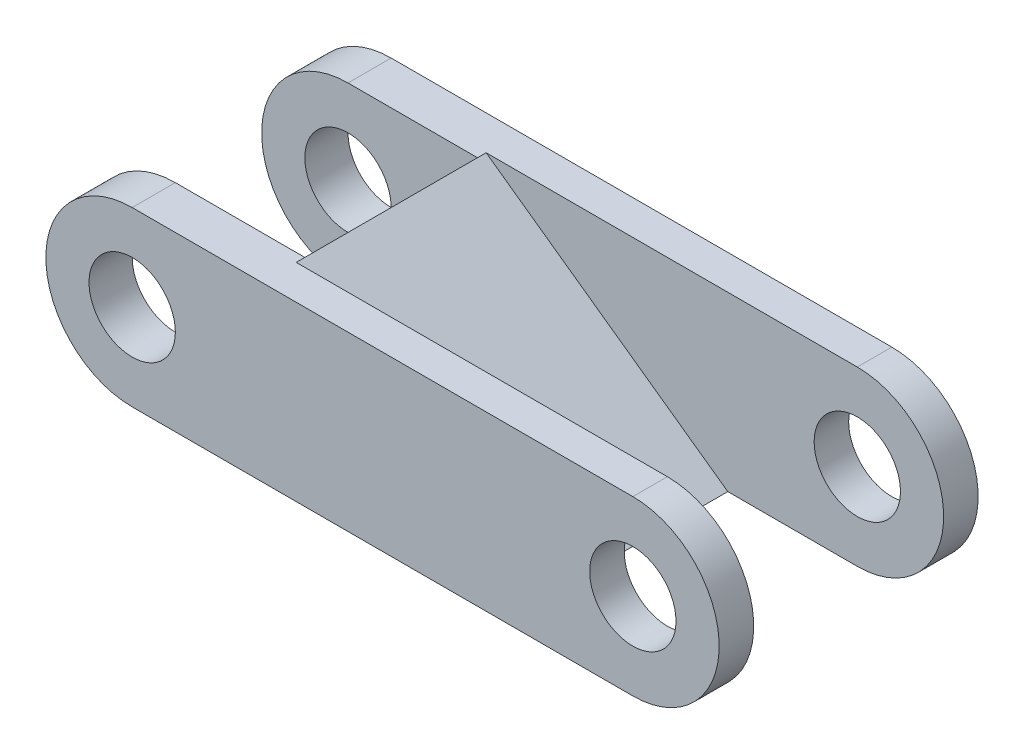
ISO-10303-21;
HEADER;
FILE_DESCRIPTION(('STEP AP214'),'2;1');
FILE_NAME('part.step','',(''),(''),'','','');
FILE_SCHEMA(('AUTOMOTIVE_DESIGN { 1 0 10303 214 1 1 1 1 }'));
ENDSEC;
DATA;
#1=APPLICATION_CONTEXT('core data for automotive mechanical design processes');
#2=APPLICATION_PROTOCOL_DEFINITION('international standard','automotive_design',2000,#1);
#3=PRODUCT_CONTEXT('',#1,'mechanical');
#4=PRODUCT('Part','Part','',(#3));
#5=PRODUCT_RELATED_PRODUCT_CATEGORY('part','',(#4));
#6=PRODUCT_DEFINITION_FORMATION('','',#4);
#7=PRODUCT_DEFINITION_CONTEXT('part definition',#1,'design');
#8=PRODUCT_DEFINITION('design','',#6,#7);
#9=PRODUCT_DEFINITION_SHAPE('','',#8);
#10=(LENGTH_UNIT() NAMED_UNIT(*) SI_UNIT(.MILLI.,.METRE.));
#11=(NAMED_UNIT(*) PLANE_ANGLE_UNIT() SI_UNIT($,.RADIAN.));
#12=(NAMED_UNIT(*) SI_UNIT($,.STERADIAN.) SOLID_ANGLE_UNIT());
#13=UNCERTAINTY_MEASURE_WITH_UNIT(LENGTH_MEASURE(1.E-05),#10,'distance_accuracy_value','');
#14=(GEOMETRIC_REPRESENTATION_CONTEXT(3) GLOBAL_UNCERTAINTY_ASSIGNED_CONTEXT((#13)) GLOBAL_UNIT_ASSIGNED_CONTEXT((#10,
#11,#12)) REPRESENTATION_CONTEXT('',''));
#15=CARTESIAN_POINT('',(0.,0.,0.));
#16=DIRECTION('',(0.,0.,1.));
#17=DIRECTION('',(1.,0.,0.));
#18=AXIS2_PLACEMENT_3D('',#15,#16,#17);
#19=CARTESIAN_POINT('',(0.,10.,30.));
#20=DIRECTION('',(0.,-1.,0.));
#21=DIRECTION('',(0.,0.,-1.));
#22=AXIS2_PLACEMENT_3D('',#19,#20,#21);
#23=PLANE('',#22);
#24=DIRECTION('',(0.,0.,1.));
#25=VECTOR('',#24,1.);
#26=CARTESIAN_POINT('',(15.,10.,-30.404313133584));
#27=LINE('',#26,#25);
#28=CARTESIAN_POINT('',(15.,10.,4.));
#29=VERTEX_POINT('',#28);
#30=CARTESIAN_POINT('',(15.,10.,5.));
#31=VERTEX_POINT('',#30);
#32=EDGE_CURVE('E55',#29,#31,#27,.T.);
#33=ORIENTED_EDGE('',*,*,#32,.F.);
#34=DIRECTION('',(-1.,0.,0.));
#35=VECTOR('',#34,1.);
#36=CARTESIAN_POINT('',(42.9938700824609,10.,4.));
#37=LINE('',#36,#35);
#38=CARTESIAN_POINT('',(57.9938700824609,10.,4.));
#39=VERTEX_POINT('',#38);
#40=EDGE_CURVE('E149',#39,#29,#37,.T.);
#41=ORIENTED_EDGE('',*,*,#40,.F.);
#42=DIRECTION('',(0.,0.,-1.));
#43=VECTOR('',#42,1.);
#44=CARTESIAN_POINT('',(57.9938700824609,10.,30.));
#45=LINE('',#44,#43);
#46=CARTESIAN_POINT('',(57.9938700824609,10.,0.));
#47=VERTEX_POINT('',#46);
#48=EDGE_CURVE('E211',#39,#47,#45,.T.);
#49=ORIENTED_EDGE('',*,*,#48,.T.);
#50=DIRECTION('',(-1.,0.,0.));
#51=VECTOR('',#50,1.);
#52=CARTESIAN_POINT('',(0.,10.,0.));
#53=LINE('',#52,#51);
#54=CARTESIAN_POINT('',(0.,10.,0.));
#55=VERTEX_POINT('',#54);
#56=EDGE_CURVE('E195',#47,#55,#53,.T.);
#57=ORIENTED_EDGE('',*,*,#56,.T.);
#58=DIRECTION('',(0.,0.,-1.));
#59=VECTOR('',#58,1.);
#60=CARTESIAN_POINT('',(0.,10.,30.));
#61=LINE('',#60,#59);
#62=CARTESIAN_POINT('',(0.,10.,5.));
#63=VERTEX_POINT('',#62);
#64=EDGE_CURVE('E86',#63,#55,#61,.T.);
#65=ORIENTED_EDGE('',*,*,#64,.F.);
#66=DIRECTION('',(-1.,0.,0.));
#67=VECTOR('',#66,1.);
#68=CARTESIAN_POINT('',(15.,10.,5.));
#69=LINE('',#68,#67);
#70=EDGE_CURVE('E300',#31,#63,#69,.T.);
#71=ORIENTED_EDGE('',*,*,#70,.F.);
#72=EDGE_LOOP('',(#33,#41,#49,#57,#65,#71));
#73=FACE_BOUND('',#72,.T.);
#74=ADVANCED_FACE('F38',(#73),#23,.F.);
#75=CARTESIAN_POINT('',(0.,0.,30.));
#76=DIRECTION('',(0.,0.,-1.));
#77=DIRECTION('',(-1.,0.,0.));
#78=AXIS2_PLACEMENT_3D('',#75,#76,#77);
#79=CYLINDRICAL_SURFACE('',#78,10.);
#80=CARTESIAN_POINT('',(0.,10.,30.));
#81=VERTEX_POINT('',#80);
#82=CARTESIAN_POINT('',(0.,10.,25.));
#83=VERTEX_POINT('',#82);
#84=EDGE_CURVE('E208',#81,#83,#61,.T.);
#85=ORIENTED_EDGE('',*,*,#84,.T.);
#86=CARTESIAN_POINT('',(0.,0.,25.));
#87=DIRECTION('',(0.,0.,1.));
#88=DIRECTION('',(1.,0.,0.));
#89=AXIS2_PLACEMENT_3D('',#86,#87,#88);
#90=CIRCLE('',#89,10.);
#91=CARTESIAN_POINT('',(0.,-10.,25.));
#92=VERTEX_POINT('',#91);
#93=EDGE_CURVE('E178',#83,#92,#90,.T.);
#94=ORIENTED_EDGE('',*,*,#93,.T.);
#95=DIRECTION('',(0.,0.,-1.));
#96=VECTOR('',#95,1.);
#97=CARTESIAN_POINT('',(0.,-10.,30.));
#98=LINE('',#97,#96);
#99=CARTESIAN_POINT('',(0.,-10.,30.));
#100=VERTEX_POINT('',#99);
#101=EDGE_CURVE('E11',#100,#92,#98,.T.);
#102=ORIENTED_EDGE('',*,*,#101,.F.);
#103=CARTESIAN_POINT('',(0.,0.,30.));
#104=DIRECTION('',(0.,0.,1.));
#105=DIRECTION('',(1.,0.,0.));
#106=AXIS2_PLACEMENT_3D('',#103,#104,#105);
#107=CIRCLE('',#106,10.);
#108=EDGE_CURVE('E193',#81,#100,#107,.T.);
#109=ORIENTED_EDGE('',*,*,#108,.F.);
#110=EDGE_LOOP('',(#85,#94,#102,#109));
#111=FACE_BOUND('',#110,.T.);
#112=ADVANCED_FACE('F263',(#111),#79,.T.);
#113=CARTESIAN_POINT('',(57.9938700824609,0.,30.));
#114=DIRECTION('',(0.,0.,-1.));
#115=DIRECTION('',(-1.,0.,0.));
#116=AXIS2_PLACEMENT_3D('',#113,#114,#115);
#117=CYLINDRICAL_SURFACE('',#116,10.);
#118=ORIENTED_EDGE('',*,*,#48,.F.);
#119=CARTESIAN_POINT('',(57.9938700824609,0.,4.));
#120=DIRECTION('',(0.,0.,-1.));
#121=DIRECTION('',(-1.,0.,0.));
#122=AXIS2_PLACEMENT_3D('',#119,#120,#121);
#123=CIRCLE('',#122,10.);
#124=CARTESIAN_POINT('',(57.9938700824609,-10.,4.));
#125=VERTEX_POINT('',#124);
#126=EDGE_CURVE('E173',#39,#125,#123,.T.);
#127=ORIENTED_EDGE('',*,*,#126,.T.);
#128=DIRECTION('',(0.,0.,-1.));
#129=VECTOR('',#128,1.);
#130=CARTESIAN_POINT('',(57.9938700824609,-10.,30.));
#131=LINE('',#130,#129);
#132=CARTESIAN_POINT('',(57.9938700824609,-10.,0.));
#133=VERTEX_POINT('',#132);
#134=EDGE_CURVE('E215',#125,#133,#131,.T.);
#135=ORIENTED_EDGE('',*,*,#134,.T.);
#136=CARTESIAN_POINT('',(57.9938700824609,0.,0.));
#137=DIRECTION('',(0.,0.,1.));
#138=DIRECTION('',(1.,0.,0.));
#139=AXIS2_PLACEMENT_3D('',#136,#137,#138);
#140=CIRCLE('',#139,10.);
#141=EDGE_CURVE('E204',#133,#47,#140,.T.);
#142=ORIENTED_EDGE('',*,*,#141,.T.);
#143=EDGE_LOOP('',(#118,#127,#135,#142));
#144=FACE_BOUND('',#143,.T.);
#145=ADVANCED_FACE('F255',(#144),#117,.T.);
#146=CARTESIAN_POINT('',(0.,0.,30.));
#147=DIRECTION('',(0.,0.,-1.));
#148=DIRECTION('',(-1.,0.,0.));
#149=AXIS2_PLACEMENT_3D('',#146,#147,#148);
#150=CYLINDRICAL_SURFACE('',#149,5.);
#151=CARTESIAN_POINT('',(0.,0.,25.));
#152=DIRECTION('',(0.,0.,1.));
#153=DIRECTION('',(1.,0.,0.));
#154=AXIS2_PLACEMENT_3D('',#151,#152,#153);
#155=CIRCLE('',#154,5.);
#156=CARTESIAN_POINT('',(5.,0.,25.));
#157=VERTEX_POINT('',#156);
#158=EDGE_CURVE('E42',#157,#157,#155,.T.);
#159=ORIENTED_EDGE('',*,*,#158,.F.);
#160=EDGE_LOOP('',(#159));
#161=FACE_BOUND('',#160,.T.);
#162=CARTESIAN_POINT('',(0.,0.,30.));
#163=DIRECTION('',(0.,0.,1.));
#164=DIRECTION('',(1.,0.,0.));
#165=AXIS2_PLACEMENT_3D('',#162,#163,#164);
#166=CIRCLE('',#165,5.);
#167=CARTESIAN_POINT('',(5.,0.,30.));
#168=VERTEX_POINT('',#167);
#169=EDGE_CURVE('E187',#168,#168,#166,.T.);
#170=ORIENTED_EDGE('',*,*,#169,.T.);
#171=EDGE_LOOP('',(#170));
#172=FACE_BOUND('',#171,.T.);
#173=ADVANCED_FACE('F234',(#161,#172),#150,.F.);
#174=CARTESIAN_POINT('',(57.9938700824609,0.,30.));
#175=DIRECTION('',(0.,0.,-1.));
#176=DIRECTION('',(-1.,0.,0.));
#177=AXIS2_PLACEMENT_3D('',#174,#175,#176);
#178=CYLINDRICAL_SURFACE('',#177,5.);
#179=CARTESIAN_POINT('',(57.9938700824609,0.,4.));
#180=DIRECTION('',(0.,0.,-1.));
#181=DIRECTION('',(-1.,0.,0.));
#182=AXIS2_PLACEMENT_3D('',#179,#180,#181);
#183=CIRCLE('',#182,5.);
#184=CARTESIAN_POINT('',(52.9938700824609,0.,4.));
#185=VERTEX_POINT('',#184);
#186=EDGE_CURVE('E171',#185,#185,#183,.T.);
#187=ORIENTED_EDGE('',*,*,#186,.F.);
#188=EDGE_LOOP('',(#187));
#189=FACE_BOUND('',#188,.T.);
#190=CARTESIAN_POINT('',(57.9938700824609,0.,0.));
#191=DIRECTION('',(0.,0.,1.));
#192=DIRECTION('',(1.,0.,0.));
#193=AXIS2_PLACEMENT_3D('',#190,#191,#192);
#194=CIRCLE('',#193,5.);
#195=CARTESIAN_POINT('',(62.9938700824609,0.,0.));
#196=VERTEX_POINT('',#195);
#197=EDGE_CURVE('E180',#196,#196,#194,.T.);
#198=ORIENTED_EDGE('',*,*,#197,.F.);
#199=EDGE_LOOP('',(#198));
#200=FACE_BOUND('',#199,.T.);
#201=ADVANCED_FACE('F245',(#189,#200),#178,.F.);
#202=CARTESIAN_POINT('',(0.,0.,30.));
#203=DIRECTION('',(0.,0.,1.));
#204=DIRECTION('',(1.,0.,0.));
#205=AXIS2_PLACEMENT_3D('',#202,#203,#204);
#206=PLANE('',#205);
#207=ORIENTED_EDGE('',*,*,#169,.F.);
#208=EDGE_LOOP('',(#207));
#209=FACE_BOUND('',#208,.T.);
#210=ORIENTED_EDGE('',*,*,#108,.T.);
#211=DIRECTION('',(1.,0.,0.));
#212=VECTOR('',#211,1.);
#213=CARTESIAN_POINT('',(0.,-10.,30.));
#214=LINE('',#213,#212);
#215=CARTESIAN_POINT('',(57.9938700824609,-10.,30.));
#216=VERTEX_POINT('',#215);
#217=EDGE_CURVE('E93',#100,#216,#214,.T.);
#218=ORIENTED_EDGE('',*,*,#217,.T.);
#219=CARTESIAN_POINT('',(57.9938700824609,0.,30.));
#220=DIRECTION('',(0.,0.,1.));
#221=DIRECTION('',(1.,0.,0.));
#222=AXIS2_PLACEMENT_3D('',#219,#220,#221);
#223=CIRCLE('',#222,10.);
#224=CARTESIAN_POINT('',(57.9938700824609,10.,30.));
#225=VERTEX_POINT('',#224);
#226=EDGE_CURVE('E197',#216,#225,#223,.T.);
#227=ORIENTED_EDGE('',*,*,#226,.T.);
#228=DIRECTION('',(-1.,0.,0.));
#229=VECTOR('',#228,1.);
#230=CARTESIAN_POINT('',(0.,10.,30.));
#231=LINE('',#230,#229);
#232=EDGE_CURVE('E64',#225,#81,#231,.T.);
#233=ORIENTED_EDGE('',*,*,#232,.T.);
#234=EDGE_LOOP('',(#210,#218,#227,#233));
#235=FACE_BOUND('',#234,.T.);
#236=CARTESIAN_POINT('',(57.9938700824609,0.,30.));
#237=DIRECTION('',(0.,0.,1.));
#238=DIRECTION('',(1.,0.,0.));
#239=AXIS2_PLACEMENT_3D('',#236,#237,#238);
#240=CIRCLE('',#239,5.);
#241=CARTESIAN_POINT('',(62.9938700824609,0.,30.));
#242=VERTEX_POINT('',#241);
#243=EDGE_CURVE('E181',#242,#242,#240,.T.);
#244=ORIENTED_EDGE('',*,*,#243,.F.);
#245=EDGE_LOOP('',(#244));
#246=FACE_BOUND('',#245,.T.);
#247=ADVANCED_FACE('F240',(#209,#235,#246),#206,.T.);
#248=CARTESIAN_POINT('',(0.,0.,0.));
#249=DIRECTION('',(0.,0.,1.));
#250=DIRECTION('',(1.,0.,0.));
#251=AXIS2_PLACEMENT_3D('',#248,#249,#250);
#252=PLANE('',#251);
#253=CARTESIAN_POINT('',(0.,0.,0.));
#254=DIRECTION('',(0.,0.,1.));
#255=DIRECTION('',(1.,0.,0.));
#256=AXIS2_PLACEMENT_3D('',#253,#254,#255);
#257=CIRCLE('',#256,10.);
#258=CARTESIAN_POINT('',(0.,-10.,0.));
#259=VERTEX_POINT('',#258);
#260=EDGE_CURVE('E190',#55,#259,#257,.T.);
#261=ORIENTED_EDGE('',*,*,#260,.F.);
#262=ORIENTED_EDGE('',*,*,#56,.F.);
#263=ORIENTED_EDGE('',*,*,#141,.F.);
#264=DIRECTION('',(1.,0.,0.));
#265=VECTOR('',#264,1.);
#266=CARTESIAN_POINT('',(0.,-10.,0.));
#267=LINE('',#266,#265);
#268=EDGE_CURVE('E201',#259,#133,#267,.T.);
#269=ORIENTED_EDGE('',*,*,#268,.F.);
#270=EDGE_LOOP('',(#261,#262,#263,#269));
#271=FACE_BOUND('',#270,.T.);
#272=CARTESIAN_POINT('',(0.,0.,0.));
#273=DIRECTION('',(0.,0.,1.));
#274=DIRECTION('',(1.,0.,0.));
#275=AXIS2_PLACEMENT_3D('',#272,#273,#274);
#276=CIRCLE('',#275,5.);
#277=CARTESIAN_POINT('',(5.,0.,0.));
#278=VERTEX_POINT('',#277);
#279=EDGE_CURVE('E184',#278,#278,#276,.T.);
#280=ORIENTED_EDGE('',*,*,#279,.T.);
#281=EDGE_LOOP('',(#280));
#282=FACE_BOUND('',#281,.T.);
#283=ORIENTED_EDGE('',*,*,#197,.T.);
#284=EDGE_LOOP('',(#283));
#285=FACE_BOUND('',#284,.T.);
#286=ADVANCED_FACE('F237',(#271,#282,#285),#252,.F.);
#287=CARTESIAN_POINT('',(0.,0.,5.));
#288=DIRECTION('',(0.,0.,-1.));
#289=DIRECTION('',(-1.,0.,0.));
#290=AXIS2_PLACEMENT_3D('',#287,#288,#289);
#291=CIRCLE('',#290,10.);
#292=CARTESIAN_POINT('',(0.,-10.,5.));
#293=VERTEX_POINT('',#292);
#294=EDGE_CURVE('E176',#293,#63,#291,.T.);
#295=ORIENTED_EDGE('',*,*,#294,.T.);
#296=ORIENTED_EDGE('',*,*,#64,.T.);
#297=ORIENTED_EDGE('',*,*,#260,.T.);
#298=EDGE_CURVE('E47',#293,#259,#98,.T.);
#299=ORIENTED_EDGE('',*,*,#298,.F.);
#300=EDGE_LOOP('',(#295,#296,#297,#299));
#301=FACE_BOUND('',#300,.T.);
#302=ADVANCED_FACE('F40',(#301),#79,.T.);
#303=CARTESIAN_POINT('',(0.,-10.,30.));
#304=DIRECTION('',(0.,1.,0.));
#305=DIRECTION('',(0.,0.,1.));
#306=AXIS2_PLACEMENT_3D('',#303,#304,#305);
#307=PLANE('',#306);
#308=ORIENTED_EDGE('',*,*,#101,.T.);
#309=DIRECTION('',(1.,0.,0.));
#310=VECTOR('',#309,1.);
#311=CARTESIAN_POINT('',(15.,-10.,25.));
#312=LINE('',#311,#310);
#313=CARTESIAN_POINT('',(15.,-10.,25.));
#314=VERTEX_POINT('',#313);
#315=EDGE_CURVE('E287',#92,#314,#312,.T.);
#316=ORIENTED_EDGE('',*,*,#315,.T.);
#317=DIRECTION('',(0.,0.,-1.));
#318=VECTOR('',#317,1.);
#319=CARTESIAN_POINT('',(15.,-10.,5.));
#320=LINE('',#319,#318);
#321=CARTESIAN_POINT('',(15.,-10.,5.));
#322=VERTEX_POINT('',#321);
#323=EDGE_CURVE('E290',#314,#322,#320,.T.);
#324=ORIENTED_EDGE('',*,*,#323,.T.);
#325=DIRECTION('',(-1.,0.,0.));
#326=VECTOR('',#325,1.);
#327=CARTESIAN_POINT('',(15.,-10.,5.));
#328=LINE('',#327,#326);
#329=EDGE_CURVE('E293',#322,#293,#328,.T.);
#330=ORIENTED_EDGE('',*,*,#329,.T.);
#331=ORIENTED_EDGE('',*,*,#298,.T.);
#332=ORIENTED_EDGE('',*,*,#268,.T.);
#333=ORIENTED_EDGE('',*,*,#134,.F.);
#334=DIRECTION('',(-1.,0.,0.));
#335=VECTOR('',#334,1.);
#336=CARTESIAN_POINT('',(42.9938700824609,-10.,4.));
#337=LINE('',#336,#335);
#338=CARTESIAN_POINT('',(42.9938700824609,-10.,4.));
#339=VERTEX_POINT('',#338);
#340=EDGE_CURVE('E147',#125,#339,#337,.T.);
#341=ORIENTED_EDGE('',*,*,#340,.T.);
#342=DIRECTION('',(0.,0.,1.));
#343=VECTOR('',#342,1.);
#344=CARTESIAN_POINT('',(42.9938700824609,-10.,26.));
#345=LINE('',#344,#343);
#346=CARTESIAN_POINT('',(42.9938700824609,-10.,26.));
#347=VERTEX_POINT('',#346);
#348=EDGE_CURVE('E139',#339,#347,#345,.T.);
#349=ORIENTED_EDGE('',*,*,#348,.T.);
#350=DIRECTION('',(1.,0.,0.));
#351=VECTOR('',#350,1.);
#352=CARTESIAN_POINT('',(42.9938700824609,-10.,26.));
#353=LINE('',#352,#351);
#354=CARTESIAN_POINT('',(57.9938700824609,-10.,26.));
#355=VERTEX_POINT('',#354);
#356=EDGE_CURVE('E143',#347,#355,#353,.T.);
#357=ORIENTED_EDGE('',*,*,#356,.T.);
#358=EDGE_CURVE('E216',#216,#355,#131,.T.);
#359=ORIENTED_EDGE('',*,*,#358,.F.);
#360=ORIENTED_EDGE('',*,*,#217,.F.);
#361=EDGE_LOOP('',(#308,#316,#324,#330,#331,#332,#333,#341,#349,#357,#359,#360));
#362=FACE_BOUND('',#361,.T.);
#363=ADVANCED_FACE('F141',(#362),#307,.F.);
#364=CARTESIAN_POINT('',(57.9938700824609,0.,26.));
#365=DIRECTION('',(0.,0.,1.));
#366=DIRECTION('',(1.,0.,0.));
#367=AXIS2_PLACEMENT_3D('',#364,#365,#366);
#368=CIRCLE('',#367,10.);
#369=CARTESIAN_POINT('',(57.9938700824609,10.,26.));
#370=VERTEX_POINT('',#369);
#371=EDGE_CURVE('E161',#355,#370,#368,.T.);
#372=ORIENTED_EDGE('',*,*,#371,.T.);
#373=EDGE_CURVE('E212',#225,#370,#45,.T.);
#374=ORIENTED_EDGE('',*,*,#373,.F.);
#375=ORIENTED_EDGE('',*,*,#226,.F.);
#376=ORIENTED_EDGE('',*,*,#358,.T.);
#377=EDGE_LOOP('',(#372,#374,#375,#376));
#378=FACE_BOUND('',#377,.T.);
#379=ADVANCED_FACE('F272',(#378),#117,.T.);
#380=DIRECTION('',(1.,0.,0.));
#381=VECTOR('',#380,1.);
#382=CARTESIAN_POINT('',(42.9938700824609,10.,26.));
#383=LINE('',#382,#381);
#384=CARTESIAN_POINT('',(15.,10.,26.));
#385=VERTEX_POINT('',#384);
#386=EDGE_CURVE('E167',#385,#370,#383,.T.);
#387=ORIENTED_EDGE('',*,*,#386,.F.);
#388=CARTESIAN_POINT('',(15.,10.,25.));
#389=VERTEX_POINT('',#388);
#390=EDGE_CURVE('E155',#389,#385,#27,.T.);
#391=ORIENTED_EDGE('',*,*,#390,.F.);
#392=DIRECTION('',(1.,0.,0.));
#393=VECTOR('',#392,1.);
#394=CARTESIAN_POINT('',(15.,10.,25.));
#395=LINE('',#394,#393);
#396=EDGE_CURVE('E303',#83,#389,#395,.T.);
#397=ORIENTED_EDGE('',*,*,#396,.F.);
#398=ORIENTED_EDGE('',*,*,#84,.F.);
#399=ORIENTED_EDGE('',*,*,#232,.F.);
#400=ORIENTED_EDGE('',*,*,#373,.T.);
#401=EDGE_LOOP('',(#387,#391,#397,#398,#399,#400));
#402=FACE_BOUND('',#401,.T.);
#403=ADVANCED_FACE('F232',(#402),#23,.F.);
#404=CARTESIAN_POINT('',(0.,0.,5.));
#405=DIRECTION('',(0.,0.,-1.));
#406=DIRECTION('',(-1.,0.,0.));
#407=AXIS2_PLACEMENT_3D('',#404,#405,#406);
#408=CIRCLE('',#407,5.);
#409=CARTESIAN_POINT('',(-5.,0.,5.));
#410=VERTEX_POINT('',#409);
#411=EDGE_CURVE('E175',#410,#410,#408,.T.);
#412=ORIENTED_EDGE('',*,*,#411,.F.);
#413=EDGE_LOOP('',(#412));
#414=FACE_BOUND('',#413,.T.);
#415=ORIENTED_EDGE('',*,*,#279,.F.);
#416=EDGE_LOOP('',(#415));
#417=FACE_BOUND('',#416,.T.);
#418=ADVANCED_FACE('F228',(#414,#417),#150,.F.);
#419=CARTESIAN_POINT('',(57.9938700824609,0.,26.));
#420=DIRECTION('',(0.,0.,1.));
#421=DIRECTION('',(1.,0.,0.));
#422=AXIS2_PLACEMENT_3D('',#419,#420,#421);
#423=CIRCLE('',#422,5.);
#424=CARTESIAN_POINT('',(62.9938700824609,0.,26.));
#425=VERTEX_POINT('',#424);
#426=EDGE_CURVE('E172',#425,#425,#423,.T.);
#427=ORIENTED_EDGE('',*,*,#426,.F.);
#428=EDGE_LOOP('',(#427));
#429=FACE_BOUND('',#428,.T.);
#430=ORIENTED_EDGE('',*,*,#243,.T.);
#431=EDGE_LOOP('',(#430));
#432=FACE_BOUND('',#431,.T.);
#433=ADVANCED_FACE('F231',(#429,#432),#178,.F.);
#434=CARTESIAN_POINT('',(42.9938700824609,-10.,4.));
#435=DIRECTION('',(0.,0.,-1.));
#436=DIRECTION('',(-1.,0.,0.));
#437=AXIS2_PLACEMENT_3D('',#434,#435,#436);
#438=PLANE('',#437);
#439=ORIENTED_EDGE('',*,*,#186,.T.);
#440=EDGE_LOOP('',(#439));
#441=FACE_BOUND('',#440,.T.);
#442=ORIENTED_EDGE('',*,*,#40,.T.);
#443=DIRECTION('',(0.813673273283126,-0.581322461586273,0.));
#444=VECTOR('',#443,1.);
#445=CARTESIAN_POINT('',(15.,10.,4.));
#446=LINE('',#445,#444);
#447=EDGE_CURVE('E158',#29,#339,#446,.T.);
#448=ORIENTED_EDGE('',*,*,#447,.T.);
#449=ORIENTED_EDGE('',*,*,#340,.F.);
#450=ORIENTED_EDGE('',*,*,#126,.F.);
#451=EDGE_LOOP('',(#442,#448,#449,#450));
#452=FACE_BOUND('',#451,.T.);
#453=ADVANCED_FACE('F260',(#441,#452),#438,.F.);
#454=CARTESIAN_POINT('',(42.9938700824609,-10.,26.));
#455=DIRECTION('',(0.,0.,1.));
#456=DIRECTION('',(1.,0.,0.));
#457=AXIS2_PLACEMENT_3D('',#454,#455,#456);
#458=PLANE('',#457);
#459=ORIENTED_EDGE('',*,*,#426,.T.);
#460=EDGE_LOOP('',(#459));
#461=FACE_BOUND('',#460,.T.);
#462=ORIENTED_EDGE('',*,*,#371,.F.);
#463=ORIENTED_EDGE('',*,*,#356,.F.);
#464=DIRECTION('',(0.813673273283126,-0.581322461586273,0.));
#465=VECTOR('',#464,1.);
#466=CARTESIAN_POINT('',(15.,10.,26.));
#467=LINE('',#466,#465);
#468=EDGE_CURVE('E153',#385,#347,#467,.T.);
#469=ORIENTED_EDGE('',*,*,#468,.F.);
#470=ORIENTED_EDGE('',*,*,#386,.T.);
#471=EDGE_LOOP('',(#462,#463,#469,#470));
#472=FACE_BOUND('',#471,.T.);
#473=ADVANCED_FACE('F160',(#461,#472),#458,.F.);
#474=CARTESIAN_POINT('',(15.,-10.,25.));
#475=DIRECTION('',(0.,0.,1.));
#476=DIRECTION('',(1.,0.,0.));
#477=AXIS2_PLACEMENT_3D('',#474,#475,#476);
#478=PLANE('',#477);
#479=ORIENTED_EDGE('',*,*,#158,.T.);
#480=EDGE_LOOP('',(#479));
#481=FACE_BOUND('',#480,.T.);
#482=ORIENTED_EDGE('',*,*,#396,.T.);
#483=DIRECTION('',(0.,1.,0.));
#484=VECTOR('',#483,1.);
#485=CARTESIAN_POINT('',(15.,-10.,25.));
#486=LINE('',#485,#484);
#487=EDGE_CURVE('E220',#314,#389,#486,.T.);
#488=ORIENTED_EDGE('',*,*,#487,.F.);
#489=ORIENTED_EDGE('',*,*,#315,.F.);
#490=ORIENTED_EDGE('',*,*,#93,.F.);
#491=EDGE_LOOP('',(#482,#488,#489,#490));
#492=FACE_BOUND('',#491,.T.);
#493=ADVANCED_FACE('F309',(#481,#492),#478,.F.);
#494=CARTESIAN_POINT('',(15.,-10.,5.));
#495=DIRECTION('',(0.,0.,-1.));
#496=DIRECTION('',(-1.,0.,0.));
#497=AXIS2_PLACEMENT_3D('',#494,#495,#496);
#498=PLANE('',#497);
#499=ORIENTED_EDGE('',*,*,#411,.T.);
#500=EDGE_LOOP('',(#499));
#501=FACE_BOUND('',#500,.T.);
#502=ORIENTED_EDGE('',*,*,#294,.F.);
#503=ORIENTED_EDGE('',*,*,#329,.F.);
#504=DIRECTION('',(0.,1.,0.));
#505=VECTOR('',#504,1.);
#506=CARTESIAN_POINT('',(15.,-10.,5.));
#507=LINE('',#506,#505);
#508=EDGE_CURVE('E292',#322,#31,#507,.T.);
#509=ORIENTED_EDGE('',*,*,#508,.T.);
#510=ORIENTED_EDGE('',*,*,#70,.T.);
#511=EDGE_LOOP('',(#502,#503,#509,#510));
#512=FACE_BOUND('',#511,.T.);
#513=ADVANCED_FACE('F225',(#501,#512),#498,.F.);
#514=CARTESIAN_POINT('',(15.,-10.,5.));
#515=DIRECTION('',(1.,0.,0.));
#516=DIRECTION('',(0.,0.,-1.));
#517=AXIS2_PLACEMENT_3D('',#514,#515,#516);
#518=PLANE('',#517);
#519=DIRECTION('',(0.,0.,-1.));
#520=VECTOR('',#519,1.);
#521=CARTESIAN_POINT('',(15.,10.,5.));
#522=LINE('',#521,#520);
#523=EDGE_CURVE('E163',#389,#31,#522,.T.);
#524=ORIENTED_EDGE('',*,*,#523,.T.);
#525=ORIENTED_EDGE('',*,*,#508,.F.);
#526=ORIENTED_EDGE('',*,*,#323,.F.);
#527=ORIENTED_EDGE('',*,*,#487,.T.);
#528=EDGE_LOOP('',(#524,#525,#526,#527));
#529=FACE_BOUND('',#528,.T.);
#530=ADVANCED_FACE('F308',(#529),#518,.F.);
#531=CARTESIAN_POINT('',(42.9938700824609,-10.,59.404313133584));
#532=DIRECTION('',(0.581322461586273,0.813673273283126,0.));
#533=DIRECTION('',(-0.813673273283126,0.581322461586273,0.));
#534=AXIS2_PLACEMENT_3D('',#531,#532,#533);
#535=PLANE('',#534);
#536=ORIENTED_EDGE('',*,*,#523,.F.);
#537=ORIENTED_EDGE('',*,*,#390,.T.);
#538=ORIENTED_EDGE('',*,*,#468,.T.);
#539=ORIENTED_EDGE('',*,*,#348,.F.);
#540=ORIENTED_EDGE('',*,*,#447,.F.);
#541=ORIENTED_EDGE('',*,*,#32,.T.);
#542=EDGE_LOOP('',(#536,#537,#538,#539,#540,#541));
#543=FACE_BOUND('',#542,.T.);
#544=ADVANCED_FACE('F154',(#543),#535,.T.);
#545=CLOSED_SHELL('',(#74,#112,#145,#173,#201,#247,#286,#302,#363,#379,#403,#418,#433,#453,#473,
#493,#513,#530,#544));
#546=MANIFOLD_SOLID_BREP('B2',#545);
#547=ADVANCED_BREP_SHAPE_REPRESENTATION('',(#18,#546),#14);
#548=SHAPE_DEFINITION_REPRESENTATION(#9,#547);
ENDSEC;
END-ISO-10303-21;
